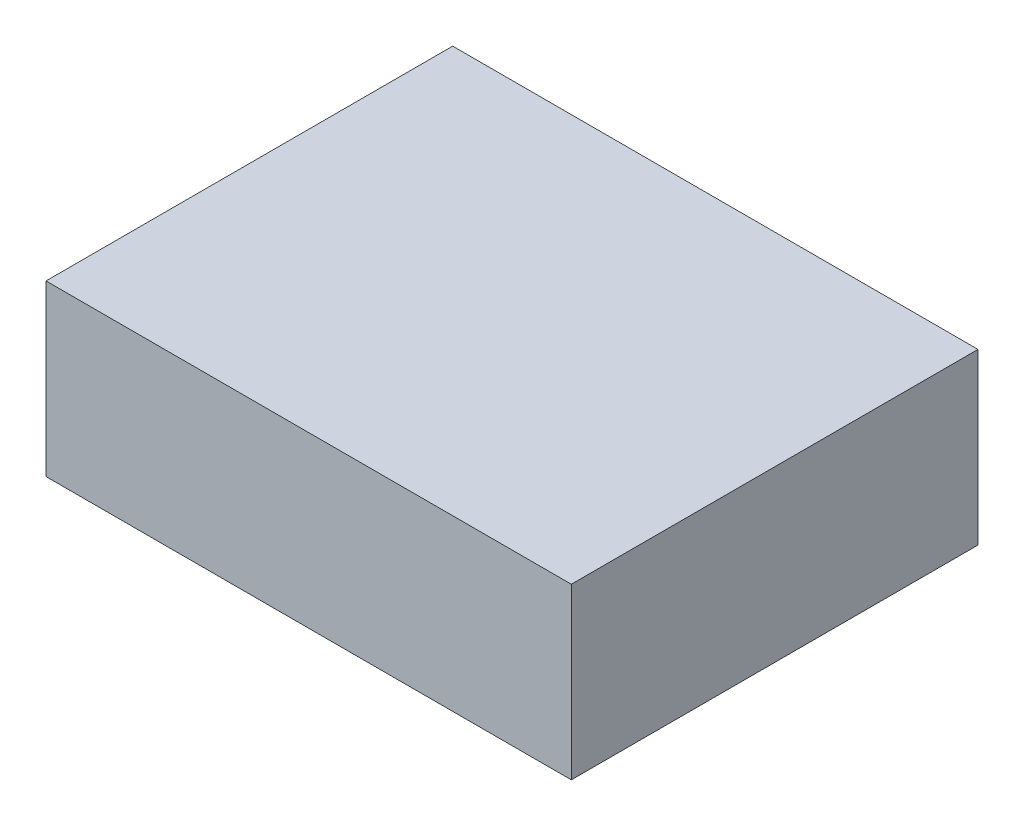
ISO-10303-21;
HEADER;
FILE_DESCRIPTION(('STEP AP214'),'2;1');
FILE_NAME('part.step','',(''),(''),'','','');
FILE_SCHEMA(('AUTOMOTIVE_DESIGN { 1 0 10303 214 1 1 1 1 }'));
ENDSEC;
DATA;
#1=APPLICATION_CONTEXT('core data for automotive mechanical design processes');
#2=APPLICATION_PROTOCOL_DEFINITION('international standard','automotive_design',2000,#1);
#3=PRODUCT_CONTEXT('',#1,'mechanical');
#4=PRODUCT('Part','Part','',(#3));
#5=PRODUCT_RELATED_PRODUCT_CATEGORY('part','',(#4));
#6=PRODUCT_DEFINITION_FORMATION('','',#4);
#7=PRODUCT_DEFINITION_CONTEXT('part definition',#1,'design');
#8=PRODUCT_DEFINITION('design','',#6,#7);
#9=PRODUCT_DEFINITION_SHAPE('','',#8);
#10=(LENGTH_UNIT() NAMED_UNIT(*) SI_UNIT(.MILLI.,.METRE.));
#11=(NAMED_UNIT(*) PLANE_ANGLE_UNIT() SI_UNIT($,.RADIAN.));
#12=(NAMED_UNIT(*) SI_UNIT($,.STERADIAN.) SOLID_ANGLE_UNIT());
#13=UNCERTAINTY_MEASURE_WITH_UNIT(LENGTH_MEASURE(1.E-05),#10,'distance_accuracy_value','');
#14=(GEOMETRIC_REPRESENTATION_CONTEXT(3) GLOBAL_UNCERTAINTY_ASSIGNED_CONTEXT((#13)) GLOBAL_UNIT_ASSIGNED_CONTEXT((#10,
#11,#12)) REPRESENTATION_CONTEXT('',''));
#15=CARTESIAN_POINT('',(0.,0.,0.));
#16=DIRECTION('',(0.,0.,1.));
#17=DIRECTION('',(1.,0.,0.));
#18=AXIS2_PLACEMENT_3D('',#15,#16,#17);
#19=CARTESIAN_POINT('',(155.,100.,-120.));
#20=DIRECTION('',(-1.,0.,0.));
#21=DIRECTION('',(0.,0.,1.));
#22=AXIS2_PLACEMENT_3D('',#19,#20,#21);
#23=PLANE('',#22);
#24=DIRECTION('',(0.,0.,-1.));
#25=VECTOR('',#24,1.);
#26=CARTESIAN_POINT('',(155.,0.,-120.));
#27=LINE('',#26,#25);
#28=CARTESIAN_POINT('',(155.,0.,120.));
#29=VERTEX_POINT('',#28);
#30=CARTESIAN_POINT('',(155.,0.,-120.));
#31=VERTEX_POINT('',#30);
#32=EDGE_CURVE('E95',#29,#31,#27,.T.);
#33=ORIENTED_EDGE('',*,*,#32,.T.);
#34=DIRECTION('',(0.,-1.,0.));
#35=VECTOR('',#34,1.);
#36=CARTESIAN_POINT('',(155.,100.,-120.));
#37=LINE('',#36,#35);
#38=CARTESIAN_POINT('',(155.,100.,-120.));
#39=VERTEX_POINT('',#38);
#40=EDGE_CURVE('E11',#39,#31,#37,.T.);
#41=ORIENTED_EDGE('',*,*,#40,.F.);
#42=DIRECTION('',(0.,0.,-1.));
#43=VECTOR('',#42,1.);
#44=CARTESIAN_POINT('',(155.,100.,-120.));
#45=LINE('',#44,#43);
#46=CARTESIAN_POINT('',(155.,100.,120.));
#47=VERTEX_POINT('',#46);
#48=EDGE_CURVE('E83',#47,#39,#45,.T.);
#49=ORIENTED_EDGE('',*,*,#48,.F.);
#50=DIRECTION('',(0.,-1.,0.));
#51=VECTOR('',#50,1.);
#52=CARTESIAN_POINT('',(155.,100.,120.));
#53=LINE('',#52,#51);
#54=EDGE_CURVE('E91',#47,#29,#53,.T.);
#55=ORIENTED_EDGE('',*,*,#54,.T.);
#56=EDGE_LOOP('',(#33,#41,#49,#55));
#57=FACE_BOUND('',#56,.T.);
#58=ADVANCED_FACE('F32',(#57),#23,.F.);
#59=CARTESIAN_POINT('',(-155.,100.,-120.));
#60=DIRECTION('',(0.,0.,1.));
#61=DIRECTION('',(1.,0.,0.));
#62=AXIS2_PLACEMENT_3D('',#59,#60,#61);
#63=PLANE('',#62);
#64=DIRECTION('',(-1.,0.,0.));
#65=VECTOR('',#64,1.);
#66=CARTESIAN_POINT('',(-155.,0.,-120.));
#67=LINE('',#66,#65);
#68=CARTESIAN_POINT('',(-155.,0.,-120.));
#69=VERTEX_POINT('',#68);
#70=EDGE_CURVE('E87',#31,#69,#67,.T.);
#71=ORIENTED_EDGE('',*,*,#70,.T.);
#72=DIRECTION('',(0.,-1.,0.));
#73=VECTOR('',#72,1.);
#74=CARTESIAN_POINT('',(-155.,100.,-120.));
#75=LINE('',#74,#73);
#76=CARTESIAN_POINT('',(-155.,100.,-120.));
#77=VERTEX_POINT('',#76);
#78=EDGE_CURVE('E40',#77,#69,#75,.T.);
#79=ORIENTED_EDGE('',*,*,#78,.F.);
#80=DIRECTION('',(-1.,0.,0.));
#81=VECTOR('',#80,1.);
#82=CARTESIAN_POINT('',(-155.,100.,-120.));
#83=LINE('',#82,#81);
#84=EDGE_CURVE('E78',#39,#77,#83,.T.);
#85=ORIENTED_EDGE('',*,*,#84,.F.);
#86=ORIENTED_EDGE('',*,*,#40,.T.);
#87=EDGE_LOOP('',(#71,#79,#85,#86));
#88=FACE_BOUND('',#87,.T.);
#89=ADVANCED_FACE('F86',(#88),#63,.F.);
#90=CARTESIAN_POINT('',(-155.,100.,-120.));
#91=DIRECTION('',(1.,0.,0.));
#92=DIRECTION('',(0.,0.,-1.));
#93=AXIS2_PLACEMENT_3D('',#90,#91,#92);
#94=PLANE('',#93);
#95=DIRECTION('',(0.,0.,1.));
#96=VECTOR('',#95,1.);
#97=CARTESIAN_POINT('',(-155.,0.,-120.));
#98=LINE('',#97,#96);
#99=CARTESIAN_POINT('',(-155.,0.,120.));
#100=VERTEX_POINT('',#99);
#101=EDGE_CURVE('E65',#69,#100,#98,.T.);
#102=ORIENTED_EDGE('',*,*,#101,.T.);
#103=DIRECTION('',(0.,-1.,0.));
#104=VECTOR('',#103,1.);
#105=CARTESIAN_POINT('',(-155.,100.,120.));
#106=LINE('',#105,#104);
#107=CARTESIAN_POINT('',(-155.,100.,120.));
#108=VERTEX_POINT('',#107);
#109=EDGE_CURVE('E88',#108,#100,#106,.T.);
#110=ORIENTED_EDGE('',*,*,#109,.F.);
#111=DIRECTION('',(0.,0.,1.));
#112=VECTOR('',#111,1.);
#113=CARTESIAN_POINT('',(-155.,100.,-120.));
#114=LINE('',#113,#112);
#115=EDGE_CURVE('E81',#77,#108,#114,.T.);
#116=ORIENTED_EDGE('',*,*,#115,.F.);
#117=ORIENTED_EDGE('',*,*,#78,.T.);
#118=EDGE_LOOP('',(#102,#110,#116,#117));
#119=FACE_BOUND('',#118,.T.);
#120=ADVANCED_FACE('F89',(#119),#94,.F.);
#121=CARTESIAN_POINT('',(-155.,100.,120.));
#122=DIRECTION('',(0.,0.,-1.));
#123=DIRECTION('',(-1.,0.,0.));
#124=AXIS2_PLACEMENT_3D('',#121,#122,#123);
#125=PLANE('',#124);
#126=DIRECTION('',(1.,0.,0.));
#127=VECTOR('',#126,1.);
#128=CARTESIAN_POINT('',(-155.,0.,120.));
#129=LINE('',#128,#127);
#130=EDGE_CURVE('E71',#100,#29,#129,.T.);
#131=ORIENTED_EDGE('',*,*,#130,.T.);
#132=ORIENTED_EDGE('',*,*,#54,.F.);
#133=DIRECTION('',(1.,0.,0.));
#134=VECTOR('',#133,1.);
#135=CARTESIAN_POINT('',(-155.,100.,120.));
#136=LINE('',#135,#134);
#137=EDGE_CURVE('E48',#108,#47,#136,.T.);
#138=ORIENTED_EDGE('',*,*,#137,.F.);
#139=ORIENTED_EDGE('',*,*,#109,.T.);
#140=EDGE_LOOP('',(#131,#132,#138,#139));
#141=FACE_BOUND('',#140,.T.);
#142=ADVANCED_FACE('F102',(#141),#125,.F.);
#143=CARTESIAN_POINT('',(0.,100.,0.));
#144=DIRECTION('',(0.,1.,0.));
#145=DIRECTION('',(0.,0.,1.));
#146=AXIS2_PLACEMENT_3D('',#143,#144,#145);
#147=PLANE('',#146);
#148=ORIENTED_EDGE('',*,*,#48,.T.);
#149=ORIENTED_EDGE('',*,*,#84,.T.);
#150=ORIENTED_EDGE('',*,*,#115,.T.);
#151=ORIENTED_EDGE('',*,*,#137,.T.);
#152=EDGE_LOOP('',(#148,#149,#150,#151));
#153=FACE_BOUND('',#152,.T.);
#154=ADVANCED_FACE('F79',(#153),#147,.T.);
#155=CARTESIAN_POINT('',(0.,0.,0.));
#156=DIRECTION('',(0.,1.,0.));
#157=DIRECTION('',(0.,0.,1.));
#158=AXIS2_PLACEMENT_3D('',#155,#156,#157);
#159=PLANE('',#158);
#160=ORIENTED_EDGE('',*,*,#32,.F.);
#161=ORIENTED_EDGE('',*,*,#130,.F.);
#162=ORIENTED_EDGE('',*,*,#101,.F.);
#163=ORIENTED_EDGE('',*,*,#70,.F.);
#164=EDGE_LOOP('',(#160,#161,#162,#163));
#165=FACE_BOUND('',#164,.T.);
#166=ADVANCED_FACE('F105',(#165),#159,.F.);
#167=CLOSED_SHELL('',(#58,#89,#120,#142,#154,#166));
#168=MANIFOLD_SOLID_BREP('B2',#167);
#169=ADVANCED_BREP_SHAPE_REPRESENTATION('',(#18,#168),#14);
#170=SHAPE_DEFINITION_REPRESENTATION(#9,#169);
ENDSEC;
END-ISO-10303-21;
